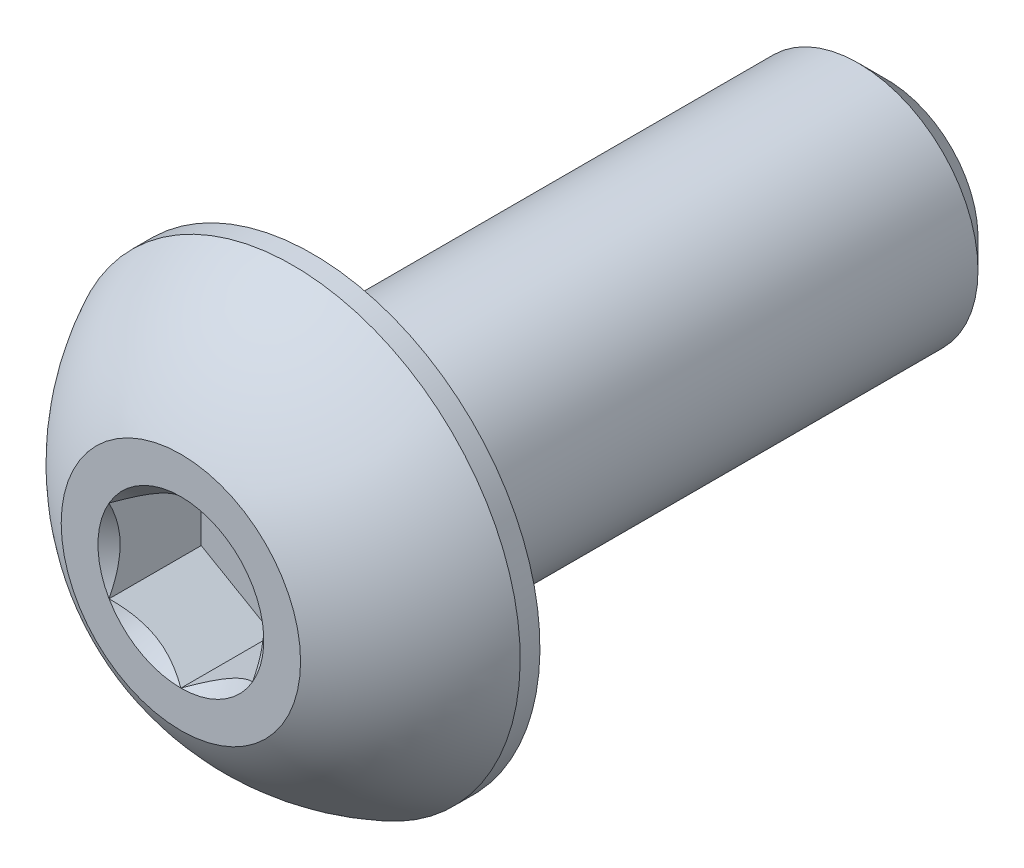
ISO-10303-21;
HEADER;
FILE_DESCRIPTION(('STEP AP214'),'2;1');
FILE_NAME('part.step','',(''),(''),'','','');
FILE_SCHEMA(('AUTOMOTIVE_DESIGN { 1 0 10303 214 1 1 1 1 }'));
ENDSEC;
DATA;
#1=APPLICATION_CONTEXT('core data for automotive mechanical design processes');
#2=APPLICATION_PROTOCOL_DEFINITION('international standard','automotive_design',2000,#1);
#3=PRODUCT_CONTEXT('',#1,'mechanical');
#4=PRODUCT('Part','Part','',(#3));
#5=PRODUCT_RELATED_PRODUCT_CATEGORY('part','',(#4));
#6=PRODUCT_DEFINITION_FORMATION('','',#4);
#7=PRODUCT_DEFINITION_CONTEXT('part definition',#1,'design');
#8=PRODUCT_DEFINITION('design','',#6,#7);
#9=PRODUCT_DEFINITION_SHAPE('','',#8);
#10=(LENGTH_UNIT() NAMED_UNIT(*) SI_UNIT(.MILLI.,.METRE.));
#11=(NAMED_UNIT(*) PLANE_ANGLE_UNIT() SI_UNIT($,.RADIAN.));
#12=(NAMED_UNIT(*) SI_UNIT($,.STERADIAN.) SOLID_ANGLE_UNIT());
#13=UNCERTAINTY_MEASURE_WITH_UNIT(LENGTH_MEASURE(1.E-05),#10,'distance_accuracy_value','');
#14=(GEOMETRIC_REPRESENTATION_CONTEXT(3) GLOBAL_UNCERTAINTY_ASSIGNED_CONTEXT((#13)) GLOBAL_UNIT_ASSIGNED_CONTEXT((#10,
#11,#12)) REPRESENTATION_CONTEXT('',''));
#15=CARTESIAN_POINT('',(0.,0.,0.));
#16=DIRECTION('',(0.,0.,1.));
#17=DIRECTION('',(1.,0.,0.));
#18=AXIS2_PLACEMENT_3D('',#15,#16,#17);
#19=CARTESIAN_POINT('',(0.,0.,-6.));
#20=DIRECTION('',(0.,0.,1.));
#21=DIRECTION('',(0.,-1.,0.));
#22=AXIS2_PLACEMENT_3D('',#19,#20,#21);
#23=PLANE('',#22);
#24=CARTESIAN_POINT('',(0.,0.,-6.));
#25=DIRECTION('',(0.,0.,1.));
#26=DIRECTION('',(0.,-1.,0.));
#27=AXIS2_PLACEMENT_3D('',#24,#25,#26);
#28=CIRCLE('',#27,1.9);
#29=CARTESIAN_POINT('',(0.,-1.9,-6.));
#30=VERTEX_POINT('',#29);
#31=EDGE_CURVE('E57',#30,#30,#28,.T.);
#32=ORIENTED_EDGE('',*,*,#31,.F.);
#33=EDGE_LOOP('',(#32));
#34=FACE_BOUND('',#33,.T.);
#35=ADVANCED_FACE('F44',(#34),#23,.F.);
#36=CARTESIAN_POINT('',(0.,0.,-6.));
#37=DIRECTION('',(0.,0.,1.));
#38=DIRECTION('',(0.,-1.,0.));
#39=AXIS2_PLACEMENT_3D('',#36,#37,#38);
#40=CONICAL_SURFACE('',#39,1.9,0.785398163397446);
#41=CARTESIAN_POINT('',(0.,0.,-5.4));
#42=DIRECTION('',(0.,0.,1.));
#43=DIRECTION('',(0.,-1.,0.));
#44=AXIS2_PLACEMENT_3D('',#41,#42,#43);
#45=CIRCLE('',#44,2.5);
#46=CARTESIAN_POINT('',(0.,-2.5,-5.4));
#47=VERTEX_POINT('',#46);
#48=EDGE_CURVE('E188',#47,#47,#45,.T.);
#49=ORIENTED_EDGE('',*,*,#48,.F.);
#50=EDGE_LOOP('',(#49));
#51=FACE_BOUND('',#50,.T.);
#52=ORIENTED_EDGE('',*,*,#31,.T.);
#53=EDGE_LOOP('',(#52));
#54=FACE_BOUND('',#53,.T.);
#55=ADVANCED_FACE('F193',(#51,#54),#40,.T.);
#56=CARTESIAN_POINT('',(0.,0.,8.75));
#57=DIRECTION('',(0.,0.,1.));
#58=DIRECTION('',(0.,-1.,0.));
#59=AXIS2_PLACEMENT_3D('',#56,#57,#58);
#60=CYLINDRICAL_SURFACE('',#59,2.5);
#61=CARTESIAN_POINT('',(0.,0.,6.));
#62=DIRECTION('',(0.,0.,1.));
#63=DIRECTION('',(0.,-1.,0.));
#64=AXIS2_PLACEMENT_3D('',#61,#62,#63);
#65=CIRCLE('',#64,2.5);
#66=CARTESIAN_POINT('',(0.,-2.5,6.));
#67=VERTEX_POINT('',#66);
#68=EDGE_CURVE('E185',#67,#67,#65,.T.);
#69=ORIENTED_EDGE('',*,*,#68,.F.);
#70=EDGE_LOOP('',(#69));
#71=FACE_BOUND('',#70,.T.);
#72=ORIENTED_EDGE('',*,*,#48,.T.);
#73=EDGE_LOOP('',(#72));
#74=FACE_BOUND('',#73,.T.);
#75=ADVANCED_FACE('F199',(#71,#74),#60,.T.);
#76=CARTESIAN_POINT('',(0.,-4.75,6.));
#77=DIRECTION('',(0.,0.,1.));
#78=DIRECTION('',(0.,-1.,0.));
#79=AXIS2_PLACEMENT_3D('',#76,#77,#78);
#80=PLANE('',#79);
#81=CARTESIAN_POINT('',(0.,0.,6.));
#82=DIRECTION('',(0.,0.,1.));
#83=DIRECTION('',(0.,-1.,0.));
#84=AXIS2_PLACEMENT_3D('',#81,#82,#83);
#85=CIRCLE('',#84,4.75);
#86=CARTESIAN_POINT('',(0.,-4.75,6.));
#87=VERTEX_POINT('',#86);
#88=EDGE_CURVE('E179',#87,#87,#85,.T.);
#89=ORIENTED_EDGE('',*,*,#88,.F.);
#90=EDGE_LOOP('',(#89));
#91=FACE_BOUND('',#90,.T.);
#92=ORIENTED_EDGE('',*,*,#68,.T.);
#93=EDGE_LOOP('',(#92));
#94=FACE_BOUND('',#93,.T.);
#95=ADVANCED_FACE('F204',(#91,#94),#80,.F.);
#96=CARTESIAN_POINT('',(0.,0.,4.09194518716578));
#97=DIRECTION('',(0.,0.,1.));
#98=DIRECTION('',(0.,-1.,0.));
#99=AXIS2_PLACEMENT_3D('',#96,#97,#98);
#100=SPHERICAL_SURFACE('',#99,5.28653711226622);
#101=CARTESIAN_POINT('',(0.,0.,8.75));
#102=DIRECTION('',(0.,0.,1.));
#103=DIRECTION('',(0.,-1.,0.));
#104=AXIS2_PLACEMENT_3D('',#101,#102,#103);
#105=CIRCLE('',#104,2.5);
#106=CARTESIAN_POINT('',(0.,-2.5,8.75));
#107=VERTEX_POINT('',#106);
#108=EDGE_CURVE('E182',#107,#107,#105,.T.);
#109=CARTESIAN_POINT('',(0.,0.,6.4125));
#110=DIRECTION('',(0.,0.,1.));
#111=DIRECTION('',(0.,-1.,0.));
#112=AXIS2_PLACEMENT_3D('',#109,#110,#111);
#113=CIRCLE('',#112,4.75);
#114=CARTESIAN_POINT('',(0.,-4.75,6.4125));
#115=VERTEX_POINT('',#114);
#116=EDGE_CURVE('E176',#115,#115,#113,.T.);
#117=CARTESIAN_POINT('',(0.,-2.5,8.75));
#118=CARTESIAN_POINT('',(0.,-2.53026679982017,8.73375571754439));
#119=CARTESIAN_POINT('',(0.,-2.56037522904967,8.71721635879359));
#120=CARTESIAN_POINT('',(0.,-2.62026400427657,8.68355394811781));
#121=CARTESIAN_POINT('',(0.,-2.65004435027396,8.66643089619284));
#122=CARTESIAN_POINT('',(0.,-2.70926561698583,8.63160755858496));
#123=CARTESIAN_POINT('',(0.,-2.73870653770032,8.61390727290205));
#124=CARTESIAN_POINT('',(0.,-2.79723777417103,8.57793620595506));
#125=CARTESIAN_POINT('',(0.,-2.82632808992725,8.55966542469097));
#126=CARTESIAN_POINT('',(0.,-2.88414706107589,8.52256030560732));
#127=CARTESIAN_POINT('',(0.,-2.9128757164683,8.50372596778776));
#128=CARTESIAN_POINT('',(0.,-2.96996045130293,8.46550089302141));
#129=CARTESIAN_POINT('',(0.,-2.99831653074514,8.44611015607464));
#130=CARTESIAN_POINT('',(0.,-3.05464533901891,8.40677965075515));
#131=CARTESIAN_POINT('',(0.,-3.08261806785047,8.38683988238244));
#132=CARTESIAN_POINT('',(0.,-3.13816954607726,8.34641889083541));
#133=CARTESIAN_POINT('',(0.,-3.1657482954725,8.3259376676611));
#134=CARTESIAN_POINT('',(0.,-3.22050133565614,8.28444154879096));
#135=CARTESIAN_POINT('',(0.,-3.24767562644454,8.26342665309514));
#136=CARTESIAN_POINT('',(0.,-3.30160942393941,8.22087117426482));
#137=CARTESIAN_POINT('',(0.,-3.32836893064588,8.19933059113032));
#138=CARTESIAN_POINT('',(0.,-3.38146299210494,8.15573192224629));
#139=CARTESIAN_POINT('',(0.,-3.40779754685752,8.13367383649675));
#140=CARTESIAN_POINT('',(0.,-3.46003169800773,8.08904854384449));
#141=CARTESIAN_POINT('',(0.,-3.48593129440535,8.06648133694176));
#142=CARTESIAN_POINT('',(0.,-3.53728568771641,8.02084637689649));
#143=CARTESIAN_POINT('',(0.,-3.56274048462986,7.99777862375395));
#144=CARTESIAN_POINT('',(0.,-3.61319560685492,7.95115133633622));
#145=CARTESIAN_POINT('',(0.,-3.63819593216655,7.92759180206105));
#146=CARTESIAN_POINT('',(0.,-3.68773261175691,7.87998990434842));
#147=CARTESIAN_POINT('',(0.,-3.71226896603565,7.85594754091097));
#148=CARTESIAN_POINT('',(0.,-3.76086838042534,7.80738912030588));
#149=CARTESIAN_POINT('',(0.,-3.78493144053629,7.78287306313824));
#150=CARTESIAN_POINT('',(0.,-3.83257512329416,7.73337657049534));
#151=CARTESIAN_POINT('',(0.,-3.85615574594108,7.70839613502008));
#152=CARTESIAN_POINT('',(0.,-3.90282559378753,7.6579803776354));
#153=CARTESIAN_POINT('',(0.,-3.92591481898706,7.63254505572599));
#154=CARTESIAN_POINT('',(0.,-3.97159309867276,7.5812291901907));
#155=CARTESIAN_POINT('',(0.,-3.99418215315894,7.55534864656483));
#156=CARTESIAN_POINT('',(0.,-4.03885150820303,7.50315217148627));
#157=CARTESIAN_POINT('',(0.,-4.06093180876093,7.47683624003357));
#158=CARTESIAN_POINT('',(0.,-4.10457526604591,7.42377898862629));
#159=CARTESIAN_POINT('',(0.,-4.12613842277298,7.3970376686717));
#160=CARTESIAN_POINT('',(0.,-4.16873939899417,7.34313980122146));
#161=CARTESIAN_POINT('',(0.,-4.1897772184883,7.3159832537258));
#162=CARTESIAN_POINT('',(0.,-4.23131952645464,7.261265249929));
#163=CARTESIAN_POINT('',(0.,-4.25182401492686,7.23370379362786));
#164=CARTESIAN_POINT('',(0.,-4.29229186971308,7.1781864448106));
#165=CARTESIAN_POINT('',(0.,-4.31225523602708,7.15023055229449));
#166=CARTESIAN_POINT('',(0.,-4.35163326096594,7.09393495350959));
#167=CARTESIAN_POINT('',(0.,-4.3710479195908,7.0655952472408));
#168=CARTESIAN_POINT('',(0.,-4.40932115213664,7.00854278926291));
#169=CARTESIAN_POINT('',(0.,-4.42817972605762,6.97983003755382));
#170=CARTESIAN_POINT('',(0.,-4.46533362339398,6.92204239871169));
#171=CARTESIAN_POINT('',(0.,-4.48362894680934,6.89296751157864));
#172=CARTESIAN_POINT('',(0.,-4.51964939166499,6.83446664966676));
#173=CARTESIAN_POINT('',(0.,-4.53737451310527,6.80504067488791));
#174=CARTESIAN_POINT('',(0.,-4.57224781803529,6.74584881826763));
#175=CARTESIAN_POINT('',(0.,-4.58939600152503,6.71608293642618));
#176=CARTESIAN_POINT('',(0.,-4.62310891815402,6.65622257765293));
#177=CARTESIAN_POINT('',(0.,-4.63967365129327,6.62612810072113));
#178=CARTESIAN_POINT('',(0.,-4.67221336026297,6.56562198025982));
#179=CARTESIAN_POINT('',(0.,-4.68818833609342,6.53521033673031));
#180=CARTESIAN_POINT('',(0.,-4.71954250823692,6.47408146319351));
#181=CARTESIAN_POINT('',(0.,-4.73492170454996,6.44336423318622));
#182=CARTESIAN_POINT('',(0.,-4.75,6.4125));
#183=B_SPLINE_CURVE_WITH_KNOTS('',3,(#117,#118,#119,#120,#121,#122,#123,#124,#125,#126,#127,
#128,#129,#130,#131,#132,#133,#134,#135,#136,#137,#138,#139,#140,#141,#142,#143,#144,#145,#146,
#147,#148,#149,#150,#151,#152,#153,#154,#155,#156,#157,#158,#159,#160,#161,#162,#163,#164,#165,
#166,#167,#168,#169,#170,#171,#172,#173,#174,#175,#176,#177,#178,#179,#180,#181,#182),
.UNSPECIFIED.,.F.,.F.,(4,2,2,2,2,2,2,2,2,2,2,2,2,2,2,2,2,2,2,2,2,2,2,2,2,2,2,2,2,2,2,2,4),(0.,
0.103049823637831,0.206099647275661,0.309149470913491,0.412199294551322,0.515249118189153,
0.618298941826983,0.721348765464814,0.824398589102644,0.927448412740475,1.0304982363783,
1.13354806001614,1.23659788365397,1.3396477072918,1.44269753092963,1.54574735456746,
1.64879717820529,1.75184700184312,1.85489682548095,1.95794664911878,2.06099647275661,
2.16404629639444,2.26709612003227,2.3701459436701,2.47319576730793,2.57624559094576,
2.67929541458359,2.78234523822142,2.88539506185925,2.98844488549709,3.09149470913492,
3.19454453277275,3.29759435641058),.UNSPECIFIED.);
#184=EDGE_CURVE('BSEAM209',#107,#115,#183,.T.);
#185=ORIENTED_EDGE('',*,*,#108,.F.);
#186=ORIENTED_EDGE('',*,*,#116,.T.);
#187=ORIENTED_EDGE('',*,*,#184,.T.);
#188=ORIENTED_EDGE('',*,*,#184,.F.);
#189=EDGE_LOOP('',(#185,#187,#186,#188));
#190=FACE_BOUND('',#189,.T.);
#191=ADVANCED_FACE('F209',(#190),#100,.T.);
#192=CARTESIAN_POINT('',(0.,-2.5,8.75));
#193=DIRECTION('',(0.,0.,-1.));
#194=DIRECTION('',(0.,1.,0.));
#195=AXIS2_PLACEMENT_3D('',#192,#193,#194);
#196=PLANE('',#195);
#197=CARTESIAN_POINT('',(0.,0.,8.75));
#198=DIRECTION('',(0.,0.,1.));
#199=DIRECTION('',(1.,0.,0.));
#200=AXIS2_PLACEMENT_3D('',#197,#198,#199);
#201=CIRCLE('',#200,1.73205080756888);
#202=CARTESIAN_POINT('',(0.,1.73205080756888,8.75));
#203=VERTEX_POINT('',#202);
#204=CARTESIAN_POINT('',(-1.5,0.866025403784438,8.75));
#205=VERTEX_POINT('',#204);
#206=EDGE_CURVE('E143',#203,#205,#201,.T.);
#207=ORIENTED_EDGE('',*,*,#206,.F.);
#208=CARTESIAN_POINT('',(1.5,0.866025403784439,8.75));
#209=VERTEX_POINT('',#208);
#210=EDGE_CURVE('E140',#209,#203,#201,.T.);
#211=ORIENTED_EDGE('',*,*,#210,.F.);
#212=CARTESIAN_POINT('',(1.5,-0.866025403784438,8.75));
#213=VERTEX_POINT('',#212);
#214=EDGE_CURVE('E110',#213,#209,#201,.T.);
#215=ORIENTED_EDGE('',*,*,#214,.F.);
#216=CARTESIAN_POINT('',(0.,-1.73205080756888,8.75));
#217=VERTEX_POINT('',#216);
#218=EDGE_CURVE('E102',#217,#213,#201,.T.);
#219=ORIENTED_EDGE('',*,*,#218,.F.);
#220=CARTESIAN_POINT('',(-1.5,-0.866025403784438,8.75));
#221=VERTEX_POINT('',#220);
#222=EDGE_CURVE('E63',#221,#217,#201,.T.);
#223=ORIENTED_EDGE('',*,*,#222,.F.);
#224=EDGE_CURVE('E70',#205,#221,#201,.T.);
#225=ORIENTED_EDGE('',*,*,#224,.F.);
#226=EDGE_LOOP('',(#207,#211,#215,#219,#223,#225));
#227=FACE_BOUND('',#226,.T.);
#228=ORIENTED_EDGE('',*,*,#108,.T.);
#229=EDGE_LOOP('',(#228));
#230=FACE_BOUND('',#229,.T.);
#231=ADVANCED_FACE('F137',(#227,#230),#196,.F.);
#232=CARTESIAN_POINT('',(0.,0.,8.75));
#233=DIRECTION('',(0.,0.,1.));
#234=DIRECTION('',(0.,-1.,0.));
#235=AXIS2_PLACEMENT_3D('',#232,#233,#234);
#236=CYLINDRICAL_SURFACE('',#235,4.75);
#237=ORIENTED_EDGE('',*,*,#116,.F.);
#238=EDGE_LOOP('',(#237));
#239=FACE_BOUND('',#238,.T.);
#240=ORIENTED_EDGE('',*,*,#88,.T.);
#241=EDGE_LOOP('',(#240));
#242=FACE_BOUND('',#241,.T.);
#243=ADVANCED_FACE('F215',(#239,#242),#236,.T.);
#244=CARTESIAN_POINT('',(0.,0.,8.75));
#245=DIRECTION('',(0.,0.,1.));
#246=DIRECTION('',(1.,0.,0.));
#247=AXIS2_PLACEMENT_3D('',#244,#245,#246);
#248=CONICAL_SURFACE('',#247,1.73205080756888,0.78539816339745);
#249=ORIENTED_EDGE('',*,*,#214,.T.);
#250=CARTESIAN_POINT('',(1.5,-1.72720812969692,9.30557851627079));
#251=CARTESIAN_POINT('',(1.5,-1.68515175699268,9.27382990785743));
#252=CARTESIAN_POINT('',(1.5,-1.64286104748673,9.24239259380738));
#253=CARTESIAN_POINT('',(1.5,-1.55771581035942,9.18026908755641));
#254=CARTESIAN_POINT('',(1.5,-1.51486114386668,9.1495830858922));
#255=CARTESIAN_POINT('',(1.5,-1.3846813415127,9.05840719242716));
#256=CARTESIAN_POINT('',(1.5,-1.29637976071654,8.99928834342677));
#257=CARTESIAN_POINT('',(1.5,-1.11121478730467,8.8832309963165));
#258=CARTESIAN_POINT('',(1.5,-1.01415038238167,8.82660955873301));
#259=CARTESIAN_POINT('',(1.5,-0.815173408897605,8.72303688126565));
#260=CARTESIAN_POINT('',(1.5,-0.713278669253285,8.67605304154167));
#261=CARTESIAN_POINT('',(1.5,-0.560333774943111,8.61857266843083));
#262=CARTESIAN_POINT('',(1.5,-0.511547982948042,8.60207538775725));
#263=CARTESIAN_POINT('',(1.5,-0.412798620136866,8.572997512927));
#264=CARTESIAN_POINT('',(1.5,-0.362834968437562,8.56041718859402));
#265=CARTESIAN_POINT('',(1.5,-0.262863235444982,8.54003619414677));
#266=CARTESIAN_POINT('',(1.5,-0.212872113808022,8.53215363274598));
#267=CARTESIAN_POINT('',(1.5,-0.112355243569545,8.52132206396901));
#268=CARTESIAN_POINT('',(1.5,-0.0618295883726276,8.51837220852435));
#269=CARTESIAN_POINT('',(1.5,0.0374291733323844,8.51762485772485));
#270=CARTESIAN_POINT('',(1.5,0.0861609672002994,8.51964473355808));
#271=CARTESIAN_POINT('',(1.5,0.183206937768827,8.52832255289676));
#272=CARTESIAN_POINT('',(1.5,0.231521073438269,8.53498094696846));
#273=CARTESIAN_POINT('',(1.5,0.328199853425436,8.55268524412257));
#274=CARTESIAN_POINT('',(1.5,0.376550616310329,8.56380581125704));
#275=CARTESIAN_POINT('',(1.5,0.472195697125599,8.58984341404871));
#276=CARTESIAN_POINT('',(1.5,0.519490103092741,8.60476013204094));
#277=CARTESIAN_POINT('',(1.5,0.668391282696625,8.65733522359607));
#278=CARTESIAN_POINT('',(1.5,0.767878709508553,8.70098128747198));
#279=CARTESIAN_POINT('',(1.5,0.962179866690725,8.7980229945931));
#280=CARTESIAN_POINT('',(1.5,1.05697519961444,8.85145366508953));
#281=CARTESIAN_POINT('',(1.5,1.23814273533383,8.96168585200456));
#282=CARTESIAN_POINT('',(1.5,1.3246994218129,9.0181879206986));
#283=CARTESIAN_POINT('',(1.5,1.45222331290673,9.10553430157866));
#284=CARTESIAN_POINT('',(1.5,1.49418091978756,9.13495775868005));
#285=CARTESIAN_POINT('',(1.5,1.57752272931476,9.19458282183046));
#286=CARTESIAN_POINT('',(1.5,1.61890708647354,9.22478421166444));
#287=CARTESIAN_POINT('',(1.5,1.66005278019494,9.25530817860946));
#288=B_SPLINE_CURVE_WITH_KNOTS('',3,(#250,#251,#252,#253,#254,#255,#256,#257,#258,#259,#260,
#261,#262,#263,#264,#265,#266,#267,#268,#269,#270,#271,#272,#273,#274,#275,#276,#277,#278,#279,
#280,#281,#282,#283,#284,#285,#286,#287),.UNSPECIFIED.,.F.,.F.,(4,2,2,2,2,2,2,2,2,2,2,2,2,2,2,2,
2,2,4),(0.,0.158079548982668,0.316198780993942,0.634850417346958,0.97169031136151,
1.30737131660667,1.46173961127089,1.61611853740677,1.76772101421409,1.91929742368538,
2.065387412096,2.21149159305544,2.36014984633872,2.50879566386709,2.83376031422673,
3.15991186985652,3.46985601802198,3.62358896039974,3.7772796264207),.UNSPECIFIED.);
#289=EDGE_CURVE('E11',#213,#209,#288,.T.);
#290=ORIENTED_EDGE('',*,*,#289,.F.);
#291=EDGE_LOOP('',(#249,#290));
#292=FACE_BOUND('',#291,.T.);
#293=ADVANCED_FACE('F114',(#292),#248,.F.);
#294=ORIENTED_EDGE('',*,*,#210,.T.);
#295=CARTESIAN_POINT('',(1.5002,0.865909933730601,8.75011548160007));
#296=CARTESIAN_POINT('',(1.44863220926292,0.895682611594166,8.72036547606733));
#297=CARTESIAN_POINT('',(1.3962020823348,0.925953159489765,8.69236248391031));
#298=CARTESIAN_POINT('',(1.2892909659444,0.987678321317123,8.64108923044014));
#299=CARTESIAN_POINT('',(1.23479980418534,1.01913880822717,8.61784750504437));
#300=CARTESIAN_POINT('',(1.12492091864275,1.08257741237344,8.57803372899222));
#301=CARTESIAN_POINT('',(1.0695611909048,1.11453936608521,8.56136158567089));
#302=CARTESIAN_POINT('',(0.957622742522849,1.1791670593912,8.5356744568181));
#303=CARTESIAN_POINT('',(0.901047443446991,1.21183082354213,8.52664029047887));
#304=CARTESIAN_POINT('',(0.803544610483559,1.26812411040032,8.51848908122685));
#305=CARTESIAN_POINT('',(0.762743091719534,1.29168087824208,8.51728225298922));
#306=CARTESIAN_POINT('',(0.681212030384142,1.33875285845138,8.51931405716227));
#307=CARTESIAN_POINT('',(0.640482505685371,1.36226806050018,8.52255367074831));
#308=CARTESIAN_POINT('',(0.559415597836585,1.40907206156905,8.53329198598196));
#309=CARTESIAN_POINT('',(0.519078615401712,1.43236062923612,8.54079465301873));
#310=CARTESIAN_POINT('',(0.43908166308597,1.47854689118996,8.55965161192829));
#311=CARTESIAN_POINT('',(0.399421991483793,1.50144441326545,8.57100755701859));
#312=CARTESIAN_POINT('',(0.297836865225516,1.56009461325633,8.60472164759267));
#313=CARTESIAN_POINT('',(0.236541446290311,1.59548353987866,8.62962184909337));
#314=CARTESIAN_POINT('',(0.146414371536686,1.64751843074894,8.67165665327158));
#315=CARTESIAN_POINT('',(0.116714860092282,1.66466545167617,8.6864251535591));
#316=CARTESIAN_POINT('',(0.0578620986162487,1.69864410935691,8.71731056594017));
#317=CARTESIAN_POINT('',(0.0287085957793626,1.71547589206761,8.73342683412171));
#318=CARTESIAN_POINT('',(-0.000200000000000088,1.73216627762271,8.75011548160007));
#319=B_SPLINE_CURVE_WITH_KNOTS('',3,(#295,#296,#297,#298,#299,#300,#301,#302,#303,#304,#305,
#306,#307,#308,#309,#310,#311,#312,#313,#314,#315,#316,#317,#318),.UNSPECIFIED.,.F.,.F.,(4,2,2,
2,2,2,2,2,2,2,2,4),(0.,0.199829143693304,0.400822987382388,0.59862372053818,0.795926240188888,
0.937113067959879,1.07833105577193,1.21968061668222,1.36109089931054,1.58570969637565,
1.69770705470964,1.80965120737194),.UNSPECIFIED.);
#320=EDGE_CURVE('E142',#209,#203,#319,.T.);
#321=ORIENTED_EDGE('',*,*,#320,.F.);
#322=EDGE_LOOP('',(#294,#321));
#323=FACE_BOUND('',#322,.T.);
#324=ADVANCED_FACE('F294',(#323),#248,.F.);
#325=ORIENTED_EDGE('',*,*,#206,.T.);
#326=CARTESIAN_POINT('',(0.000199999999999484,1.73216627762271,8.75011548160007));
#327=CARTESIAN_POINT('',(-0.0513677907370758,1.70239359975915,8.72036547606733));
#328=CARTESIAN_POINT('',(-0.103797917665201,1.67212305186355,8.69236248391031));
#329=CARTESIAN_POINT('',(-0.210709034055597,1.61039789003619,8.64108923044014));
#330=CARTESIAN_POINT('',(-0.265200195814661,1.57893740312614,8.61784750504437));
#331=CARTESIAN_POINT('',(-0.375079081357249,1.51549879897987,8.57803372899222));
#332=CARTESIAN_POINT('',(-0.4304388090952,1.4835368452681,8.5613615856709));
#333=CARTESIAN_POINT('',(-0.542377257477151,1.41890915196211,8.5356744568181));
#334=CARTESIAN_POINT('',(-0.598952556553009,1.38624538781118,8.52664029047887));
#335=CARTESIAN_POINT('',(-0.696455389516441,1.32995210095299,8.51848908122685));
#336=CARTESIAN_POINT('',(-0.737256908280467,1.30639533311124,8.51728225298922));
#337=CARTESIAN_POINT('',(-0.818787969615859,1.25932335290193,8.51931405716227));
#338=CARTESIAN_POINT('',(-0.85951749431463,1.23580815085313,8.52255367074831));
#339=CARTESIAN_POINT('',(-0.940584402163416,1.18900414978427,8.53329198598196));
#340=CARTESIAN_POINT('',(-0.980921384598288,1.16571558211719,8.54079465301873));
#341=CARTESIAN_POINT('',(-1.06091833691403,1.11952932016335,8.55965161192829));
#342=CARTESIAN_POINT('',(-1.10057800851621,1.09663179808786,8.57100755701859));
#343=CARTESIAN_POINT('',(-1.20216313477448,1.03798159809698,8.60472164759267));
#344=CARTESIAN_POINT('',(-1.26345855370969,1.00259267147465,8.62962184909337));
#345=CARTESIAN_POINT('',(-1.35358562846331,0.950557780604374,8.67165665327158));
#346=CARTESIAN_POINT('',(-1.38328513990772,0.933410759677147,8.6864251535591));
#347=CARTESIAN_POINT('',(-1.44213790138375,0.899432101996406,8.71731056594017));
#348=CARTESIAN_POINT('',(-1.47129140422064,0.88260031928571,8.73342683412171));
#349=CARTESIAN_POINT('',(-1.5002,0.8659099337306,8.75011548160007));
#350=B_SPLINE_CURVE_WITH_KNOTS('',3,(#326,#327,#328,#329,#330,#331,#332,#333,#334,#335,#336,
#337,#338,#339,#340,#341,#342,#343,#344,#345,#346,#347,#348,#349),.UNSPECIFIED.,.F.,.F.,(4,2,2,
2,2,2,2,2,2,2,2,4),(0.,0.199829143693304,0.400822987382389,0.598623720538181,0.795926240188889,
0.937113067959881,1.07833105577193,1.21968061668222,1.36109089931054,1.58570969637565,
1.69770705470964,1.80965120737194),.UNSPECIFIED.);
#351=EDGE_CURVE('E146',#203,#205,#350,.T.);
#352=ORIENTED_EDGE('',*,*,#351,.F.);
#353=EDGE_LOOP('',(#325,#352));
#354=FACE_BOUND('',#353,.T.);
#355=ADVANCED_FACE('F149',(#354),#248,.F.);
#356=ORIENTED_EDGE('',*,*,#224,.T.);
#357=CARTESIAN_POINT('',(-1.5,-1.72720812969692,9.30557851627079));
#358=CARTESIAN_POINT('',(-1.5,-1.68515175699268,9.27382990785743));
#359=CARTESIAN_POINT('',(-1.5,-1.64286104748673,9.24239259380738));
#360=CARTESIAN_POINT('',(-1.5,-1.55771581035942,9.18026908755641));
#361=CARTESIAN_POINT('',(-1.5,-1.51486114386668,9.1495830858922));
#362=CARTESIAN_POINT('',(-1.5,-1.3846813415127,9.05840719242716));
#363=CARTESIAN_POINT('',(-1.5,-1.29637976071654,8.99928834342677));
#364=CARTESIAN_POINT('',(-1.5,-1.11121478730467,8.88323099631651));
#365=CARTESIAN_POINT('',(-1.5,-1.01415038238167,8.82660955873301));
#366=CARTESIAN_POINT('',(-1.5,-0.815173408897605,8.72303688126565));
#367=CARTESIAN_POINT('',(-1.5,-0.713278669253285,8.67605304154167));
#368=CARTESIAN_POINT('',(-1.5,-0.560333774943111,8.61857266843083));
#369=CARTESIAN_POINT('',(-1.5,-0.511547982948042,8.60207538775725));
#370=CARTESIAN_POINT('',(-1.5,-0.412798620136866,8.572997512927));
#371=CARTESIAN_POINT('',(-1.5,-0.362834968437562,8.56041718859402));
#372=CARTESIAN_POINT('',(-1.5,-0.262863235444981,8.54003619414677));
#373=CARTESIAN_POINT('',(-1.5,-0.212872113808022,8.53215363274598));
#374=CARTESIAN_POINT('',(-1.5,-0.112355243569544,8.52132206396901));
#375=CARTESIAN_POINT('',(-1.5,-0.061829588372627,8.51837220852435));
#376=CARTESIAN_POINT('',(-1.5,0.0374291733323849,8.51762485772485));
#377=CARTESIAN_POINT('',(-1.5,0.0861609672002996,8.51964473355808));
#378=CARTESIAN_POINT('',(-1.5,0.183206937768827,8.52832255289676));
#379=CARTESIAN_POINT('',(-1.5,0.231521073438269,8.53498094696846));
#380=CARTESIAN_POINT('',(-1.5,0.328199853425436,8.55268524412257));
#381=CARTESIAN_POINT('',(-1.5,0.376550616310329,8.56380581125704));
#382=CARTESIAN_POINT('',(-1.5,0.472195697125599,8.58984341404871));
#383=CARTESIAN_POINT('',(-1.5,0.519490103092741,8.60476013204094));
#384=CARTESIAN_POINT('',(-1.5,0.668391282696625,8.65733522359607));
#385=CARTESIAN_POINT('',(-1.5,0.767878709508553,8.70098128747198));
#386=CARTESIAN_POINT('',(-1.5,0.962179866690724,8.7980229945931));
#387=CARTESIAN_POINT('',(-1.5,1.05697519961444,8.85145366508953));
#388=CARTESIAN_POINT('',(-1.5,1.23814273533383,8.96168585200456));
#389=CARTESIAN_POINT('',(-1.5,1.3246994218129,9.0181879206986));
#390=CARTESIAN_POINT('',(-1.5,1.45222331290673,9.10553430157866));
#391=CARTESIAN_POINT('',(-1.5,1.49418091978756,9.13495775868005));
#392=CARTESIAN_POINT('',(-1.5,1.57752272931476,9.19458282183046));
#393=CARTESIAN_POINT('',(-1.5,1.61890708647354,9.22478421166444));
#394=CARTESIAN_POINT('',(-1.5,1.66005278019494,9.25530817860946));
#395=B_SPLINE_CURVE_WITH_KNOTS('',3,(#357,#358,#359,#360,#361,#362,#363,#364,#365,#366,#367,
#368,#369,#370,#371,#372,#373,#374,#375,#376,#377,#378,#379,#380,#381,#382,#383,#384,#385,#386,
#387,#388,#389,#390,#391,#392,#393,#394),.UNSPECIFIED.,.F.,.F.,(4,2,2,2,2,2,2,2,2,2,2,2,2,2,2,2,
2,2,4),(0.,0.158079548982669,0.316198780993942,0.634850417346957,0.971690311361509,
1.30737131660667,1.46173961127089,1.61611853740677,1.7677210142141,1.91929742368538,
2.065387412096,2.21149159305544,2.36014984633872,2.50879566386709,2.83376031422673,
3.15991186985652,3.46985601802197,3.62358896039974,3.7772796264207),.UNSPECIFIED.);
#396=EDGE_CURVE('E152',#205,#221,#395,.F.);
#397=ORIENTED_EDGE('',*,*,#396,.F.);
#398=EDGE_LOOP('',(#356,#397));
#399=FACE_BOUND('',#398,.T.);
#400=ADVANCED_FACE('F153',(#399),#248,.F.);
#401=ORIENTED_EDGE('',*,*,#222,.T.);
#402=CARTESIAN_POINT('',(-1.5002,-0.865909933730601,8.75011548160007));
#403=CARTESIAN_POINT('',(-1.44863220926292,-0.895682611594166,8.72036547606733));
#404=CARTESIAN_POINT('',(-1.3962020823348,-0.925953159489765,8.69236248391032));
#405=CARTESIAN_POINT('',(-1.2892909659444,-0.987678321317123,8.64108923044014));
#406=CARTESIAN_POINT('',(-1.23479980418534,-1.01913880822717,8.61784750504437));
#407=CARTESIAN_POINT('',(-1.12492091864275,-1.08257741237344,8.57803372899222));
#408=CARTESIAN_POINT('',(-1.0695611909048,-1.11453936608521,8.5613615856709));
#409=CARTESIAN_POINT('',(-0.957622742522849,-1.1791670593912,8.53567445681811));
#410=CARTESIAN_POINT('',(-0.901047443446991,-1.21183082354213,8.52664029047887));
#411=CARTESIAN_POINT('',(-0.803544610483559,-1.26812411040032,8.51848908122685));
#412=CARTESIAN_POINT('',(-0.762743091719534,-1.29168087824208,8.51728225298922));
#413=CARTESIAN_POINT('',(-0.681212030384142,-1.33875285845138,8.51931405716227));
#414=CARTESIAN_POINT('',(-0.64048250568537,-1.36226806050018,8.52255367074831));
#415=CARTESIAN_POINT('',(-0.559415597836584,-1.40907206156905,8.53329198598196));
#416=CARTESIAN_POINT('',(-0.519078615401712,-1.43236062923612,8.54079465301874));
#417=CARTESIAN_POINT('',(-0.439081663085969,-1.47854689118996,8.55965161192829));
#418=CARTESIAN_POINT('',(-0.399421991483792,-1.50144441326545,8.57100755701859));
#419=CARTESIAN_POINT('',(-0.297836865225515,-1.56009461325633,8.60472164759267));
#420=CARTESIAN_POINT('',(-0.236541446290311,-1.59548353987866,8.62962184909337));
#421=CARTESIAN_POINT('',(-0.146414371536686,-1.64751843074894,8.67165665327158));
#422=CARTESIAN_POINT('',(-0.116714860092282,-1.66466545167617,8.6864251535591));
#423=CARTESIAN_POINT('',(-0.057862098616249,-1.69864410935691,8.71731056594017));
#424=CARTESIAN_POINT('',(-0.0287085957793625,-1.71547589206761,8.73342683412171));
#425=CARTESIAN_POINT('',(0.000200000000000476,-1.73216627762271,8.75011548160007));
#426=B_SPLINE_CURVE_WITH_KNOTS('',3,(#402,#403,#404,#405,#406,#407,#408,#409,#410,#411,#412,
#413,#414,#415,#416,#417,#418,#419,#420,#421,#422,#423,#424,#425),.UNSPECIFIED.,.F.,.F.,(4,2,2,
2,2,2,2,2,2,2,2,4),(0.,0.199829143693304,0.400822987382388,0.59862372053818,0.795926240188889,
0.937113067959881,1.07833105577193,1.21968061668222,1.36109089931054,1.58570969637565,
1.69770705470964,1.80965120737194),.UNSPECIFIED.);
#427=EDGE_CURVE('E126',#221,#217,#426,.T.);
#428=ORIENTED_EDGE('',*,*,#427,.F.);
#429=EDGE_LOOP('',(#401,#428));
#430=FACE_BOUND('',#429,.T.);
#431=ADVANCED_FACE('F243',(#430),#248,.F.);
#432=ORIENTED_EDGE('',*,*,#218,.T.);
#433=CARTESIAN_POINT('',(-0.000199999999999644,-1.73216627762272,8.75011548160007));
#434=CARTESIAN_POINT('',(0.0513677907370762,-1.70239359975915,8.72036547606733));
#435=CARTESIAN_POINT('',(0.103797917665201,-1.67212305186355,8.69236248391032));
#436=CARTESIAN_POINT('',(0.210709034055597,-1.61039789003619,8.64108923044014));
#437=CARTESIAN_POINT('',(0.265200195814661,-1.57893740312614,8.61784750504437));
#438=CARTESIAN_POINT('',(0.375079081357249,-1.51549879897987,8.57803372899222));
#439=CARTESIAN_POINT('',(0.4304388090952,-1.4835368452681,8.5613615856709));
#440=CARTESIAN_POINT('',(0.542377257477151,-1.41890915196211,8.53567445681811));
#441=CARTESIAN_POINT('',(0.598952556553009,-1.38624538781118,8.52664029047887));
#442=CARTESIAN_POINT('',(0.696455389516441,-1.32995210095299,8.51848908122685));
#443=CARTESIAN_POINT('',(0.737256908280466,-1.30639533311124,8.51728225298922));
#444=CARTESIAN_POINT('',(0.818787969615858,-1.25932335290193,8.51931405716227));
#445=CARTESIAN_POINT('',(0.85951749431463,-1.23580815085313,8.52255367074831));
#446=CARTESIAN_POINT('',(0.940584402163416,-1.18900414978427,8.53329198598196));
#447=CARTESIAN_POINT('',(0.980921384598288,-1.16571558211719,8.54079465301874));
#448=CARTESIAN_POINT('',(1.06091833691403,-1.11952932016335,8.55965161192829));
#449=CARTESIAN_POINT('',(1.10057800851621,-1.09663179808786,8.57100755701859));
#450=CARTESIAN_POINT('',(1.20216313477448,-1.03798159809698,8.60472164759267));
#451=CARTESIAN_POINT('',(1.26345855370969,-1.00259267147465,8.62962184909337));
#452=CARTESIAN_POINT('',(1.35358562846331,-0.950557780604374,8.67165665327158));
#453=CARTESIAN_POINT('',(1.38328513990772,-0.933410759677147,8.6864251535591));
#454=CARTESIAN_POINT('',(1.44213790138375,-0.899432101996406,8.71731056594017));
#455=CARTESIAN_POINT('',(1.47129140422064,-0.882600319285709,8.73342683412171));
#456=CARTESIAN_POINT('',(1.5002,-0.8659099337306,8.75011548160007));
#457=B_SPLINE_CURVE_WITH_KNOTS('',3,(#433,#434,#435,#436,#437,#438,#439,#440,#441,#442,#443,
#444,#445,#446,#447,#448,#449,#450,#451,#452,#453,#454,#455,#456),.UNSPECIFIED.,.F.,.F.,(4,2,2,
2,2,2,2,2,2,2,2,4),(0.,0.199829143693305,0.400822987382389,0.598623720538181,0.795926240188889,
0.937113067959881,1.07833105577193,1.21968061668222,1.36109089931054,1.58570969637565,
1.69770705470964,1.80965120737194),.UNSPECIFIED.);
#458=EDGE_CURVE('E106',#217,#213,#457,.T.);
#459=ORIENTED_EDGE('',*,*,#458,.F.);
#460=EDGE_LOOP('',(#432,#459));
#461=FACE_BOUND('',#460,.T.);
#462=ADVANCED_FACE('F104',(#461),#248,.F.);
#463=CARTESIAN_POINT('',(1.5,-0.866025403784438,6.825));
#464=DIRECTION('',(0.,0.,1.));
#465=DIRECTION('',(1.,0.,0.));
#466=AXIS2_PLACEMENT_3D('',#463,#464,#465);
#467=PLANE('',#466);
#468=DIRECTION('',(0.866025403784438,0.5,0.));
#469=VECTOR('',#468,1.);
#470=CARTESIAN_POINT('',(0.,-1.73205080756888,6.825));
#471=LINE('',#470,#469);
#472=CARTESIAN_POINT('',(0.,-1.73205080756888,6.825));
#473=VERTEX_POINT('',#472);
#474=CARTESIAN_POINT('',(1.5,-0.866025403784438,6.825));
#475=VERTEX_POINT('',#474);
#476=EDGE_CURVE('E125',#473,#475,#471,.T.);
#477=ORIENTED_EDGE('',*,*,#476,.T.);
#478=DIRECTION('',(0.,1.,0.));
#479=VECTOR('',#478,1.);
#480=CARTESIAN_POINT('',(1.5,-0.866025403784438,6.825));
#481=LINE('',#480,#479);
#482=CARTESIAN_POINT('',(1.5,0.866025403784439,6.825));
#483=VERTEX_POINT('',#482);
#484=EDGE_CURVE('E130',#475,#483,#481,.T.);
#485=ORIENTED_EDGE('',*,*,#484,.T.);
#486=DIRECTION('',(-0.866025403784439,0.5,0.));
#487=VECTOR('',#486,1.);
#488=CARTESIAN_POINT('',(1.5,0.866025403784439,6.825));
#489=LINE('',#488,#487);
#490=CARTESIAN_POINT('',(0.,1.73205080756888,6.825));
#491=VERTEX_POINT('',#490);
#492=EDGE_CURVE('E277',#483,#491,#489,.T.);
#493=ORIENTED_EDGE('',*,*,#492,.T.);
#494=DIRECTION('',(-0.866025403784438,-0.5,0.));
#495=VECTOR('',#494,1.);
#496=CARTESIAN_POINT('',(0.,1.73205080756888,6.825));
#497=LINE('',#496,#495);
#498=CARTESIAN_POINT('',(-1.5,0.866025403784438,6.825));
#499=VERTEX_POINT('',#498);
#500=EDGE_CURVE('E279',#491,#499,#497,.T.);
#501=ORIENTED_EDGE('',*,*,#500,.T.);
#502=DIRECTION('',(0.,-1.,0.));
#503=VECTOR('',#502,1.);
#504=CARTESIAN_POINT('',(-1.5,0.866025403784438,6.825));
#505=LINE('',#504,#503);
#506=CARTESIAN_POINT('',(-1.5,-0.866025403784439,6.825));
#507=VERTEX_POINT('',#506);
#508=EDGE_CURVE('E167',#499,#507,#505,.T.);
#509=ORIENTED_EDGE('',*,*,#508,.T.);
#510=DIRECTION('',(0.866025403784439,-0.5,0.));
#511=VECTOR('',#510,1.);
#512=CARTESIAN_POINT('',(-1.5,-0.866025403784439,6.825));
#513=LINE('',#512,#511);
#514=EDGE_CURVE('E133',#507,#473,#513,.T.);
#515=ORIENTED_EDGE('',*,*,#514,.T.);
#516=EDGE_LOOP('',(#477,#485,#493,#501,#509,#515));
#517=FACE_BOUND('',#516,.T.);
#518=ADVANCED_FACE('F242',(#517),#467,.T.);
#519=CARTESIAN_POINT('',(1.5,-0.866025403784438,6.825));
#520=DIRECTION('',(1.,0.,0.));
#521=DIRECTION('',(0.,0.,-1.));
#522=AXIS2_PLACEMENT_3D('',#519,#520,#521);
#523=PLANE('',#522);
#524=DIRECTION('',(0.,0.,1.));
#525=VECTOR('',#524,1.);
#526=CARTESIAN_POINT('',(1.5,-0.866025403784438,6.825));
#527=LINE('',#526,#525);
#528=EDGE_CURVE('E122',#475,#213,#527,.T.);
#529=ORIENTED_EDGE('',*,*,#528,.T.);
#530=ORIENTED_EDGE('',*,*,#289,.T.);
#531=DIRECTION('',(0.,0.,1.));
#532=VECTOR('',#531,1.);
#533=CARTESIAN_POINT('',(1.5,0.866025403784439,6.825));
#534=LINE('',#533,#532);
#535=EDGE_CURVE('E132',#483,#209,#534,.T.);
#536=ORIENTED_EDGE('',*,*,#535,.F.);
#537=ORIENTED_EDGE('',*,*,#484,.F.);
#538=EDGE_LOOP('',(#529,#530,#536,#537));
#539=FACE_BOUND('',#538,.T.);
#540=ADVANCED_FACE('F128',(#539),#523,.F.);
#541=CARTESIAN_POINT('',(1.5,0.866025403784439,6.825));
#542=DIRECTION('',(0.5,0.866025403784439,0.));
#543=DIRECTION('',(-0.866025403784439,0.5,0.));
#544=AXIS2_PLACEMENT_3D('',#541,#542,#543);
#545=PLANE('',#544);
#546=ORIENTED_EDGE('',*,*,#535,.T.);
#547=ORIENTED_EDGE('',*,*,#320,.T.);
#548=DIRECTION('',(0.,0.,1.));
#549=VECTOR('',#548,1.);
#550=CARTESIAN_POINT('',(0.,1.73205080756888,6.825));
#551=LINE('',#550,#549);
#552=EDGE_CURVE('E163',#491,#203,#551,.T.);
#553=ORIENTED_EDGE('',*,*,#552,.F.);
#554=ORIENTED_EDGE('',*,*,#492,.F.);
#555=EDGE_LOOP('',(#546,#547,#553,#554));
#556=FACE_BOUND('',#555,.T.);
#557=ADVANCED_FACE('F268',(#556),#545,.F.);
#558=CARTESIAN_POINT('',(0.,1.73205080756888,6.825));
#559=DIRECTION('',(-0.5,0.866025403784438,0.));
#560=DIRECTION('',(-0.866025403784439,-0.5,0.));
#561=AXIS2_PLACEMENT_3D('',#558,#559,#560);
#562=PLANE('',#561);
#563=ORIENTED_EDGE('',*,*,#552,.T.);
#564=ORIENTED_EDGE('',*,*,#351,.T.);
#565=DIRECTION('',(0.,0.,1.));
#566=VECTOR('',#565,1.);
#567=CARTESIAN_POINT('',(-1.5,0.866025403784438,6.825));
#568=LINE('',#567,#566);
#569=EDGE_CURVE('E161',#499,#205,#568,.T.);
#570=ORIENTED_EDGE('',*,*,#569,.F.);
#571=ORIENTED_EDGE('',*,*,#500,.F.);
#572=EDGE_LOOP('',(#563,#564,#570,#571));
#573=FACE_BOUND('',#572,.T.);
#574=ADVANCED_FACE('F159',(#573),#562,.F.);
#575=CARTESIAN_POINT('',(-1.5,0.866025403784438,6.825));
#576=DIRECTION('',(-1.,0.,0.));
#577=DIRECTION('',(0.,0.,1.));
#578=AXIS2_PLACEMENT_3D('',#575,#576,#577);
#579=PLANE('',#578);
#580=ORIENTED_EDGE('',*,*,#569,.T.);
#581=ORIENTED_EDGE('',*,*,#396,.T.);
#582=DIRECTION('',(0.,0.,1.));
#583=VECTOR('',#582,1.);
#584=CARTESIAN_POINT('',(-1.5,-0.866025403784439,6.825));
#585=LINE('',#584,#583);
#586=EDGE_CURVE('E169',#507,#221,#585,.T.);
#587=ORIENTED_EDGE('',*,*,#586,.F.);
#588=ORIENTED_EDGE('',*,*,#508,.F.);
#589=EDGE_LOOP('',(#580,#581,#587,#588));
#590=FACE_BOUND('',#589,.T.);
#591=ADVANCED_FACE('F165',(#590),#579,.F.);
#592=CARTESIAN_POINT('',(-1.5,-0.866025403784439,6.825));
#593=DIRECTION('',(-0.5,-0.866025403784439,0.));
#594=DIRECTION('',(0.866025403784439,-0.5,0.));
#595=AXIS2_PLACEMENT_3D('',#592,#593,#594);
#596=PLANE('',#595);
#597=ORIENTED_EDGE('',*,*,#586,.T.);
#598=ORIENTED_EDGE('',*,*,#427,.T.);
#599=DIRECTION('',(0.,0.,1.));
#600=VECTOR('',#599,1.);
#601=CARTESIAN_POINT('',(0.,-1.73205080756888,6.825));
#602=LINE('',#601,#600);
#603=EDGE_CURVE('E124',#473,#217,#602,.T.);
#604=ORIENTED_EDGE('',*,*,#603,.F.);
#605=ORIENTED_EDGE('',*,*,#514,.F.);
#606=EDGE_LOOP('',(#597,#598,#604,#605));
#607=FACE_BOUND('',#606,.T.);
#608=ADVANCED_FACE('F224',(#607),#596,.F.);
#609=CARTESIAN_POINT('',(0.,-1.73205080756888,6.825));
#610=DIRECTION('',(0.5,-0.866025403784438,0.));
#611=DIRECTION('',(0.866025403784439,0.5,0.));
#612=AXIS2_PLACEMENT_3D('',#609,#610,#611);
#613=PLANE('',#612);
#614=ORIENTED_EDGE('',*,*,#603,.T.);
#615=ORIENTED_EDGE('',*,*,#458,.T.);
#616=ORIENTED_EDGE('',*,*,#528,.F.);
#617=ORIENTED_EDGE('',*,*,#476,.F.);
#618=EDGE_LOOP('',(#614,#615,#616,#617));
#619=FACE_BOUND('',#618,.T.);
#620=ADVANCED_FACE('F120',(#619),#613,.F.);
#621=CLOSED_SHELL('',(#35,#55,#75,#95,#191,#231,#243,#293,#324,#355,#400,#431,#462,#518,#540,
#557,#574,#591,#608,#620));
#622=MANIFOLD_SOLID_BREP('B2',#621);
#623=ADVANCED_BREP_SHAPE_REPRESENTATION('',(#18,#622),#14);
#624=SHAPE_DEFINITION_REPRESENTATION(#9,#623);
ENDSEC;
END-ISO-10303-21;
